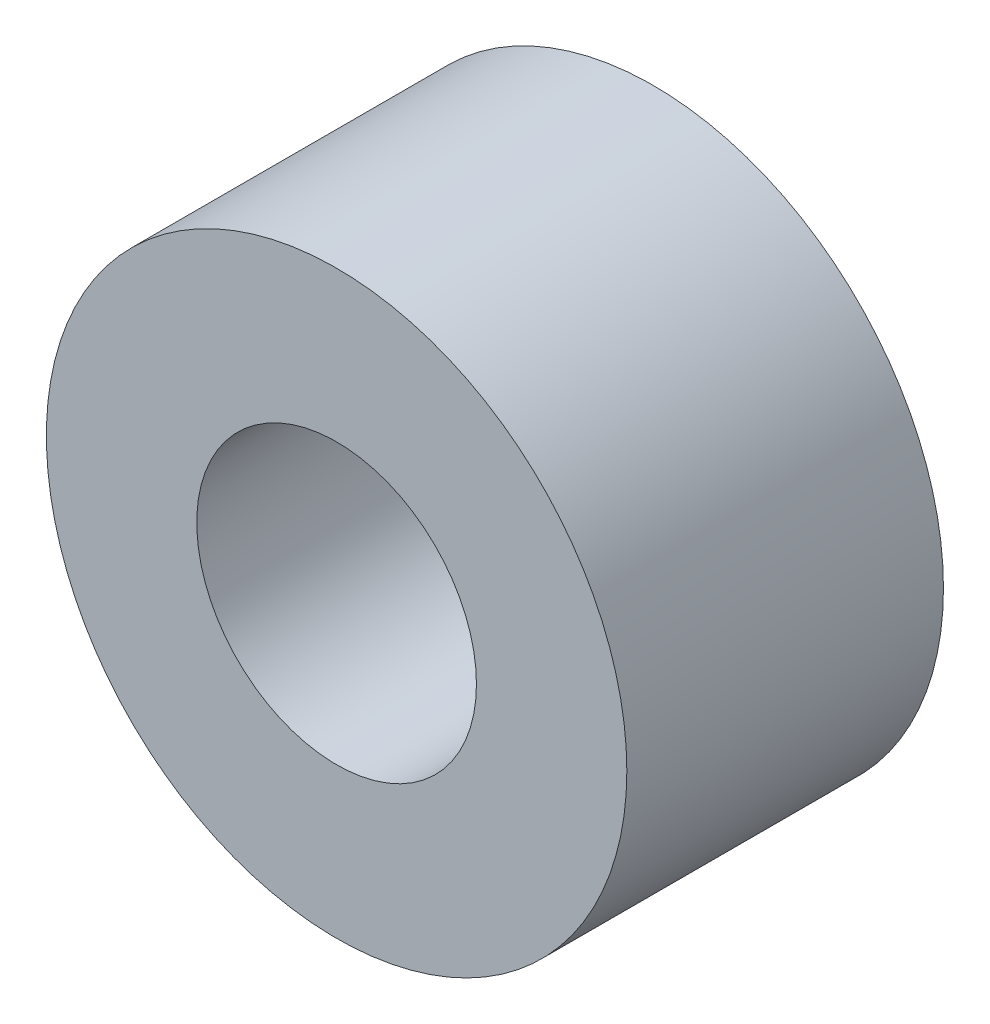
ISO-10303-21;
HEADER;
FILE_DESCRIPTION(('STEP AP214'),'2;1');
FILE_NAME('part.step','',(''),(''),'','','');
FILE_SCHEMA(('AUTOMOTIVE_DESIGN { 1 0 10303 214 1 1 1 1 }'));
ENDSEC;
DATA;
#1=APPLICATION_CONTEXT('core data for automotive mechanical design processes');
#2=APPLICATION_PROTOCOL_DEFINITION('international standard','automotive_design',2000,#1);
#3=PRODUCT_CONTEXT('',#1,'mechanical');
#4=PRODUCT('Part','Part','',(#3));
#5=PRODUCT_RELATED_PRODUCT_CATEGORY('part','',(#4));
#6=PRODUCT_DEFINITION_FORMATION('','',#4);
#7=PRODUCT_DEFINITION_CONTEXT('part definition',#1,'design');
#8=PRODUCT_DEFINITION('design','',#6,#7);
#9=PRODUCT_DEFINITION_SHAPE('','',#8);
#10=(LENGTH_UNIT() NAMED_UNIT(*) SI_UNIT(.MILLI.,.METRE.));
#11=(NAMED_UNIT(*) PLANE_ANGLE_UNIT() SI_UNIT($,.RADIAN.));
#12=(NAMED_UNIT(*) SI_UNIT($,.STERADIAN.) SOLID_ANGLE_UNIT());
#13=UNCERTAINTY_MEASURE_WITH_UNIT(LENGTH_MEASURE(1.E-05),#10,'distance_accuracy_value','');
#14=(GEOMETRIC_REPRESENTATION_CONTEXT(3) GLOBAL_UNCERTAINTY_ASSIGNED_CONTEXT((#13)) GLOBAL_UNIT_ASSIGNED_CONTEXT((#10,
#11,#12)) REPRESENTATION_CONTEXT('',''));
#15=CARTESIAN_POINT('',(0.,0.,0.));
#16=DIRECTION('',(0.,0.,1.));
#17=DIRECTION('',(1.,0.,0.));
#18=AXIS2_PLACEMENT_3D('',#15,#16,#17);
#19=CARTESIAN_POINT('',(0.,0.,6.));
#20=DIRECTION('',(0.,0.,1.));
#21=DIRECTION('',(1.,0.,0.));
#22=AXIS2_PLACEMENT_3D('',#19,#20,#21);
#23=PLANE('',#22);
#24=CARTESIAN_POINT('',(0.,0.,6.));
#25=DIRECTION('',(0.,0.,1.));
#26=DIRECTION('',(1.,0.,0.));
#27=AXIS2_PLACEMENT_3D('',#24,#25,#26);
#28=CIRCLE('',#27,5.5);
#29=CARTESIAN_POINT('',(5.5,0.,6.));
#30=VERTEX_POINT('',#29);
#31=EDGE_CURVE('E10',#30,#30,#28,.T.);
#32=ORIENTED_EDGE('',*,*,#31,.T.);
#33=EDGE_LOOP('',(#32));
#34=FACE_BOUND('',#33,.T.);
#35=CARTESIAN_POINT('',(0.,0.,6.));
#36=DIRECTION('',(0.,0.,1.));
#37=DIRECTION('',(1.,0.,0.));
#38=AXIS2_PLACEMENT_3D('',#35,#36,#37);
#39=CIRCLE('',#38,2.65);
#40=CARTESIAN_POINT('',(2.65,0.,6.));
#41=VERTEX_POINT('',#40);
#42=EDGE_CURVE('E51',#41,#41,#39,.T.);
#43=ORIENTED_EDGE('',*,*,#42,.F.);
#44=EDGE_LOOP('',(#43));
#45=FACE_BOUND('',#44,.T.);
#46=ADVANCED_FACE('F36',(#34,#45),#23,.T.);
#47=CARTESIAN_POINT('',(0.,0.,0.));
#48=DIRECTION('',(0.,0.,1.));
#49=DIRECTION('',(1.,0.,0.));
#50=AXIS2_PLACEMENT_3D('',#47,#48,#49);
#51=PLANE('',#50);
#52=CARTESIAN_POINT('',(0.,0.,0.));
#53=DIRECTION('',(0.,0.,1.));
#54=DIRECTION('',(1.,0.,0.));
#55=AXIS2_PLACEMENT_3D('',#52,#53,#54);
#56=CIRCLE('',#55,5.5);
#57=CARTESIAN_POINT('',(5.5,0.,0.));
#58=VERTEX_POINT('',#57);
#59=EDGE_CURVE('E40',#58,#58,#56,.T.);
#60=ORIENTED_EDGE('',*,*,#59,.F.);
#61=EDGE_LOOP('',(#60));
#62=FACE_BOUND('',#61,.T.);
#63=CARTESIAN_POINT('',(0.,0.,0.));
#64=DIRECTION('',(0.,0.,1.));
#65=DIRECTION('',(1.,0.,0.));
#66=AXIS2_PLACEMENT_3D('',#63,#64,#65);
#67=CIRCLE('',#66,2.65);
#68=CARTESIAN_POINT('',(2.65,0.,0.));
#69=VERTEX_POINT('',#68);
#70=EDGE_CURVE('E53',#69,#69,#67,.T.);
#71=ORIENTED_EDGE('',*,*,#70,.T.);
#72=EDGE_LOOP('',(#71));
#73=FACE_BOUND('',#72,.T.);
#74=ADVANCED_FACE('F65',(#62,#73),#51,.F.);
#75=CARTESIAN_POINT('',(0.,0.,6.));
#76=DIRECTION('',(0.,0.,-1.));
#77=DIRECTION('',(-1.,0.,0.));
#78=AXIS2_PLACEMENT_3D('',#75,#76,#77);
#79=CYLINDRICAL_SURFACE('',#78,5.5);
#80=ORIENTED_EDGE('',*,*,#31,.F.);
#81=EDGE_LOOP('',(#80));
#82=FACE_BOUND('',#81,.T.);
#83=ORIENTED_EDGE('',*,*,#59,.T.);
#84=EDGE_LOOP('',(#83));
#85=FACE_BOUND('',#84,.T.);
#86=ADVANCED_FACE('F38',(#82,#85),#79,.T.);
#87=CARTESIAN_POINT('',(0.,0.,6.));
#88=DIRECTION('',(0.,0.,-1.));
#89=DIRECTION('',(-1.,0.,0.));
#90=AXIS2_PLACEMENT_3D('',#87,#88,#89);
#91=CYLINDRICAL_SURFACE('',#90,2.65);
#92=ORIENTED_EDGE('',*,*,#42,.T.);
#93=EDGE_LOOP('',(#92));
#94=FACE_BOUND('',#93,.T.);
#95=ORIENTED_EDGE('',*,*,#70,.F.);
#96=EDGE_LOOP('',(#95));
#97=FACE_BOUND('',#96,.T.);
#98=ADVANCED_FACE('F61',(#94,#97),#91,.F.);
#99=CLOSED_SHELL('',(#46,#74,#86,#98));
#100=MANIFOLD_SOLID_BREP('B2',#99);
#101=ADVANCED_BREP_SHAPE_REPRESENTATION('',(#18,#100),#14);
#102=SHAPE_DEFINITION_REPRESENTATION(#9,#101);
ENDSEC;
END-ISO-10303-21;
